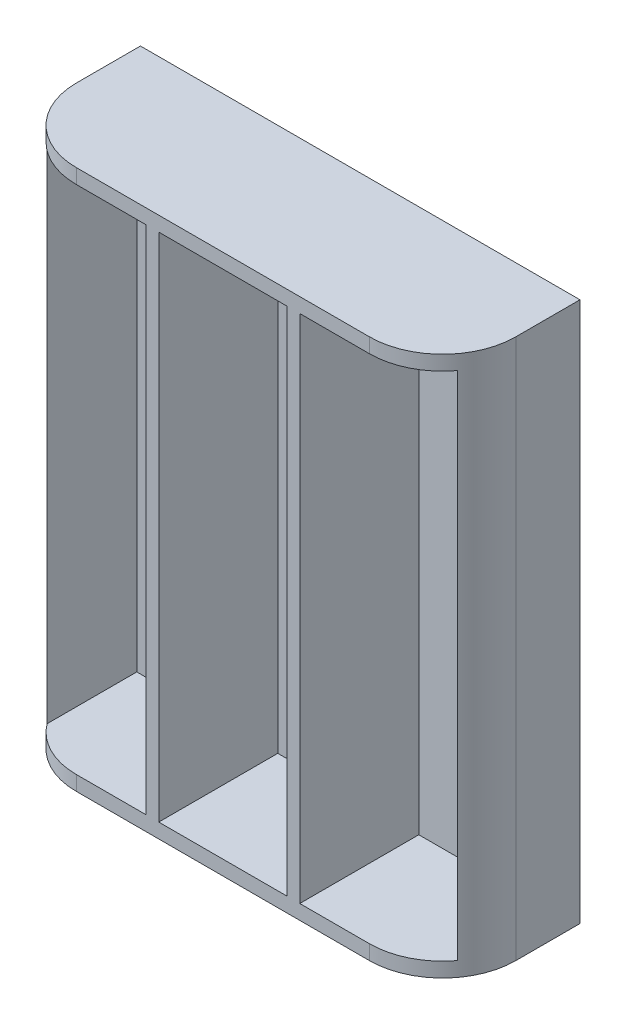
ISO-10303-21;
HEADER;
FILE_DESCRIPTION(('STEP AP214'),'2;1');
FILE_NAME('part.step','',(''),(''),'','','');
FILE_SCHEMA(('AUTOMOTIVE_DESIGN { 1 0 10303 214 1 1 1 1 }'));
ENDSEC;
DATA;
#1=APPLICATION_CONTEXT('core data for automotive mechanical design processes');
#2=APPLICATION_PROTOCOL_DEFINITION('international standard','automotive_design',2000,#1);
#3=PRODUCT_CONTEXT('',#1,'mechanical');
#4=PRODUCT('Part','Part','',(#3));
#5=PRODUCT_RELATED_PRODUCT_CATEGORY('part','',(#4));
#6=PRODUCT_DEFINITION_FORMATION('','',#4);
#7=PRODUCT_DEFINITION_CONTEXT('part definition',#1,'design');
#8=PRODUCT_DEFINITION('design','',#6,#7);
#9=PRODUCT_DEFINITION_SHAPE('','',#8);
#10=(LENGTH_UNIT() NAMED_UNIT(*) SI_UNIT(.MILLI.,.METRE.));
#11=(NAMED_UNIT(*) PLANE_ANGLE_UNIT() SI_UNIT($,.RADIAN.));
#12=(NAMED_UNIT(*) SI_UNIT($,.STERADIAN.) SOLID_ANGLE_UNIT());
#13=UNCERTAINTY_MEASURE_WITH_UNIT(LENGTH_MEASURE(1.E-05),#10,'distance_accuracy_value','');
#14=(GEOMETRIC_REPRESENTATION_CONTEXT(3) GLOBAL_UNCERTAINTY_ASSIGNED_CONTEXT((#13)) GLOBAL_UNIT_ASSIGNED_CONTEXT((#10,
#11,#12)) REPRESENTATION_CONTEXT('',''));
#15=CARTESIAN_POINT('',(0.,0.,0.));
#16=DIRECTION('',(0.,0.,1.));
#17=DIRECTION('',(1.,0.,0.));
#18=AXIS2_PLACEMENT_3D('',#15,#16,#17);
#19=CARTESIAN_POINT('',(24.,-29.5,2.));
#20=DIRECTION('',(-1.,0.,0.));
#21=DIRECTION('',(0.,0.,1.));
#22=AXIS2_PLACEMENT_3D('',#19,#20,#21);
#23=PLANE('',#22);
#24=DIRECTION('',(0.,1.,0.));
#25=VECTOR('',#24,1.);
#26=CARTESIAN_POINT('',(24.,-29.5,0.));
#27=LINE('',#26,#25);
#28=CARTESIAN_POINT('',(24.,-29.5,0.));
#29=VERTEX_POINT('',#28);
#30=CARTESIAN_POINT('',(24.,29.5,0.));
#31=VERTEX_POINT('',#30);
#32=EDGE_CURVE('E303',#29,#31,#27,.T.);
#33=ORIENTED_EDGE('',*,*,#32,.T.);
#34=DIRECTION('',(0.,0.,-1.));
#35=VECTOR('',#34,1.);
#36=CARTESIAN_POINT('',(24.,29.5,2.));
#37=LINE('',#36,#35);
#38=CARTESIAN_POINT('',(24.,29.5,7.));
#39=VERTEX_POINT('',#38);
#40=EDGE_CURVE('E321',#39,#31,#37,.T.);
#41=ORIENTED_EDGE('',*,*,#40,.F.);
#42=DIRECTION('',(0.,-1.,0.));
#43=VECTOR('',#42,1.);
#44=CARTESIAN_POINT('',(24.,79.2292670366254,7.));
#45=LINE('',#44,#43);
#46=CARTESIAN_POINT('',(24.,-29.5,7.));
#47=VERTEX_POINT('',#46);
#48=EDGE_CURVE('E277',#39,#47,#45,.T.);
#49=ORIENTED_EDGE('',*,*,#48,.T.);
#50=DIRECTION('',(0.,0.,-1.));
#51=VECTOR('',#50,1.);
#52=CARTESIAN_POINT('',(24.,-29.5,2.));
#53=LINE('',#52,#51);
#54=EDGE_CURVE('E312',#47,#29,#53,.T.);
#55=ORIENTED_EDGE('',*,*,#54,.T.);
#56=EDGE_LOOP('',(#33,#41,#49,#55));
#57=FACE_BOUND('',#56,.T.);
#58=ADVANCED_FACE('F35',(#57),#23,.F.);
#59=CARTESIAN_POINT('',(-24.,29.5,2.));
#60=DIRECTION('',(0.,-1.,0.));
#61=DIRECTION('',(0.,0.,-1.));
#62=AXIS2_PLACEMENT_3D('',#59,#60,#61);
#63=PLANE('',#62);
#64=DIRECTION('',(-1.,0.,0.));
#65=VECTOR('',#64,1.);
#66=CARTESIAN_POINT('',(-24.,29.5,0.));
#67=LINE('',#66,#65);
#68=CARTESIAN_POINT('',(-24.,29.5,0.));
#69=VERTEX_POINT('',#68);
#70=EDGE_CURVE('E306',#31,#69,#67,.T.);
#71=ORIENTED_EDGE('',*,*,#70,.T.);
#72=DIRECTION('',(0.,0.,-1.));
#73=VECTOR('',#72,1.);
#74=CARTESIAN_POINT('',(-24.,29.5,2.));
#75=LINE('',#74,#73);
#76=CARTESIAN_POINT('',(-24.,29.5,7.));
#77=VERTEX_POINT('',#76);
#78=EDGE_CURVE('E318',#77,#69,#75,.T.);
#79=ORIENTED_EDGE('',*,*,#78,.F.);
#80=CARTESIAN_POINT('',(-16.,29.5,7.));
#81=DIRECTION('',(0.,-1.,0.));
#82=DIRECTION('',(0.,0.,-1.));
#83=AXIS2_PLACEMENT_3D('',#80,#81,#82);
#84=CIRCLE('',#83,8.);
#85=CARTESIAN_POINT('',(-16.,29.5,15.));
#86=VERTEX_POINT('',#85);
#87=EDGE_CURVE('E274',#77,#86,#84,.F.);
#88=ORIENTED_EDGE('',*,*,#87,.T.);
#89=DIRECTION('',(1.,0.,0.));
#90=VECTOR('',#89,1.);
#91=CARTESIAN_POINT('',(-16.,29.5,15.));
#92=LINE('',#91,#90);
#93=CARTESIAN_POINT('',(16.,29.5,15.));
#94=VERTEX_POINT('',#93);
#95=EDGE_CURVE('E280',#86,#94,#92,.T.);
#96=ORIENTED_EDGE('',*,*,#95,.T.);
#97=CARTESIAN_POINT('',(16.,29.5,7.));
#98=DIRECTION('',(0.,-1.,0.));
#99=DIRECTION('',(0.,0.,-1.));
#100=AXIS2_PLACEMENT_3D('',#97,#98,#99);
#101=CIRCLE('',#100,8.);
#102=EDGE_CURVE('E276',#94,#39,#101,.F.);
#103=ORIENTED_EDGE('',*,*,#102,.T.);
#104=ORIENTED_EDGE('',*,*,#40,.T.);
#105=EDGE_LOOP('',(#71,#79,#88,#96,#103,#104));
#106=FACE_BOUND('',#105,.T.);
#107=ADVANCED_FACE('F370',(#106),#63,.F.);
#108=CARTESIAN_POINT('',(-24.,-29.5,2.));
#109=DIRECTION('',(1.,0.,0.));
#110=DIRECTION('',(0.,0.,-1.));
#111=AXIS2_PLACEMENT_3D('',#108,#109,#110);
#112=PLANE('',#111);
#113=DIRECTION('',(0.,-1.,0.));
#114=VECTOR('',#113,1.);
#115=CARTESIAN_POINT('',(-24.,-29.5,0.));
#116=LINE('',#115,#114);
#117=CARTESIAN_POINT('',(-24.,-29.5,0.));
#118=VERTEX_POINT('',#117);
#119=EDGE_CURVE('E308',#69,#118,#116,.T.);
#120=ORIENTED_EDGE('',*,*,#119,.T.);
#121=DIRECTION('',(0.,0.,-1.));
#122=VECTOR('',#121,1.);
#123=CARTESIAN_POINT('',(-24.,-29.5,2.));
#124=LINE('',#123,#122);
#125=CARTESIAN_POINT('',(-24.,-29.5,7.));
#126=VERTEX_POINT('',#125);
#127=EDGE_CURVE('E315',#126,#118,#124,.T.);
#128=ORIENTED_EDGE('',*,*,#127,.F.);
#129=DIRECTION('',(0.,-1.,0.));
#130=VECTOR('',#129,1.);
#131=CARTESIAN_POINT('',(-24.,79.2292670366254,7.));
#132=LINE('',#131,#130);
#133=EDGE_CURVE('E292',#77,#126,#132,.T.);
#134=ORIENTED_EDGE('',*,*,#133,.F.);
#135=ORIENTED_EDGE('',*,*,#78,.T.);
#136=EDGE_LOOP('',(#120,#128,#134,#135));
#137=FACE_BOUND('',#136,.T.);
#138=ADVANCED_FACE('F373',(#137),#112,.F.);
#139=CARTESIAN_POINT('',(-24.,-29.5,2.));
#140=DIRECTION('',(0.,1.,0.));
#141=DIRECTION('',(0.,0.,1.));
#142=AXIS2_PLACEMENT_3D('',#139,#140,#141);
#143=PLANE('',#142);
#144=DIRECTION('',(1.,0.,0.));
#145=VECTOR('',#144,1.);
#146=CARTESIAN_POINT('',(-24.,-29.5,0.));
#147=LINE('',#146,#145);
#148=EDGE_CURVE('E310',#118,#29,#147,.T.);
#149=ORIENTED_EDGE('',*,*,#148,.T.);
#150=ORIENTED_EDGE('',*,*,#54,.F.);
#151=CARTESIAN_POINT('',(16.,-29.5,7.));
#152=DIRECTION('',(0.,-1.,0.));
#153=DIRECTION('',(0.,0.,-1.));
#154=AXIS2_PLACEMENT_3D('',#151,#152,#153);
#155=CIRCLE('',#154,8.);
#156=CARTESIAN_POINT('',(16.,-29.5,15.));
#157=VERTEX_POINT('',#156);
#158=EDGE_CURVE('E273',#47,#157,#155,.T.);
#159=ORIENTED_EDGE('',*,*,#158,.T.);
#160=DIRECTION('',(-1.,0.,0.));
#161=VECTOR('',#160,1.);
#162=CARTESIAN_POINT('',(-16.,-29.5,15.));
#163=LINE('',#162,#161);
#164=CARTESIAN_POINT('',(-16.,-29.5,15.));
#165=VERTEX_POINT('',#164);
#166=EDGE_CURVE('E283',#157,#165,#163,.T.);
#167=ORIENTED_EDGE('',*,*,#166,.T.);
#168=CARTESIAN_POINT('',(-16.,-29.5,7.));
#169=DIRECTION('',(0.,-1.,0.));
#170=DIRECTION('',(0.,0.,1.));
#171=AXIS2_PLACEMENT_3D('',#168,#169,#170);
#172=CIRCLE('',#171,8.);
#173=EDGE_CURVE('E286',#165,#126,#172,.T.);
#174=ORIENTED_EDGE('',*,*,#173,.T.);
#175=ORIENTED_EDGE('',*,*,#127,.T.);
#176=EDGE_LOOP('',(#149,#150,#159,#167,#174,#175));
#177=FACE_BOUND('',#176,.T.);
#178=ADVANCED_FACE('F348',(#177),#143,.F.);
#179=CARTESIAN_POINT('',(0.,0.,0.));
#180=DIRECTION('',(0.,0.,-1.));
#181=DIRECTION('',(-1.,0.,0.));
#182=AXIS2_PLACEMENT_3D('',#179,#180,#181);
#183=PLANE('',#182);
#184=ORIENTED_EDGE('',*,*,#32,.F.);
#185=ORIENTED_EDGE('',*,*,#148,.F.);
#186=ORIENTED_EDGE('',*,*,#119,.F.);
#187=ORIENTED_EDGE('',*,*,#70,.F.);
#188=EDGE_LOOP('',(#184,#185,#186,#187));
#189=FACE_BOUND('',#188,.T.);
#190=ADVANCED_FACE('F378',(#189),#183,.T.);
#191=CARTESIAN_POINT('',(16.,79.2292670366254,7.));
#192=DIRECTION('',(0.,-1.,0.));
#193=DIRECTION('',(0.,0.,-1.));
#194=AXIS2_PLACEMENT_3D('',#191,#192,#193);
#195=CYLINDRICAL_SURFACE('',#194,8.);
#196=CARTESIAN_POINT('',(16.,-27.9,7.));
#197=DIRECTION('',(0.,-1.,0.));
#198=DIRECTION('',(1.,0.,0.));
#199=AXIS2_PLACEMENT_3D('',#196,#197,#198);
#200=CIRCLE('',#199,8.);
#201=CARTESIAN_POINT('',(16.,-27.9,15.));
#202=VERTEX_POINT('',#201);
#203=CARTESIAN_POINT('',(22.4,-27.9,11.8));
#204=VERTEX_POINT('',#203);
#205=EDGE_CURVE('E239',#202,#204,#200,.F.);
#206=ORIENTED_EDGE('',*,*,#205,.F.);
#207=DIRECTION('',(0.,-1.,0.));
#208=VECTOR('',#207,1.);
#209=CARTESIAN_POINT('',(16.,79.2292670366254,15.));
#210=LINE('',#209,#208);
#211=EDGE_CURVE('E289',#202,#157,#210,.T.);
#212=ORIENTED_EDGE('',*,*,#211,.T.);
#213=ORIENTED_EDGE('',*,*,#158,.F.);
#214=ORIENTED_EDGE('',*,*,#48,.F.);
#215=ORIENTED_EDGE('',*,*,#102,.F.);
#216=CARTESIAN_POINT('',(16.,27.9,15.));
#217=VERTEX_POINT('',#216);
#218=EDGE_CURVE('E299',#94,#217,#210,.T.);
#219=ORIENTED_EDGE('',*,*,#218,.T.);
#220=CARTESIAN_POINT('',(16.,27.9,7.));
#221=DIRECTION('',(0.,1.,0.));
#222=DIRECTION('',(-1.,0.,0.));
#223=AXIS2_PLACEMENT_3D('',#220,#221,#222);
#224=CIRCLE('',#223,8.);
#225=CARTESIAN_POINT('',(22.4,27.9,11.8));
#226=VERTEX_POINT('',#225);
#227=EDGE_CURVE('E57',#226,#217,#224,.F.);
#228=ORIENTED_EDGE('',*,*,#227,.F.);
#229=DIRECTION('',(0.,-1.,0.));
#230=VECTOR('',#229,1.);
#231=CARTESIAN_POINT('',(22.4,79.2292670366254,11.8));
#232=LINE('',#231,#230);
#233=EDGE_CURVE('E326',#204,#226,#232,.F.);
#234=ORIENTED_EDGE('',*,*,#233,.F.);
#235=EDGE_LOOP('',(#206,#212,#213,#214,#215,#219,#228,#234));
#236=FACE_BOUND('',#235,.T.);
#237=ADVANCED_FACE('F352',(#236),#195,.T.);
#238=CARTESIAN_POINT('',(-16.,79.2292670366254,7.));
#239=DIRECTION('',(0.,-1.,0.));
#240=DIRECTION('',(0.,0.,-1.));
#241=AXIS2_PLACEMENT_3D('',#238,#239,#240);
#242=CYLINDRICAL_SURFACE('',#241,8.);
#243=CARTESIAN_POINT('',(-16.,-27.9,7.));
#244=DIRECTION('',(0.,-1.,0.));
#245=DIRECTION('',(0.,0.,-1.));
#246=AXIS2_PLACEMENT_3D('',#243,#244,#245);
#247=CIRCLE('',#246,8.);
#248=CARTESIAN_POINT('',(-22.4,-27.9,11.8));
#249=VERTEX_POINT('',#248);
#250=CARTESIAN_POINT('',(-16.,-27.9,15.));
#251=VERTEX_POINT('',#250);
#252=EDGE_CURVE('E209',#249,#251,#247,.F.);
#253=ORIENTED_EDGE('',*,*,#252,.F.);
#254=DIRECTION('',(0.,-1.,0.));
#255=VECTOR('',#254,1.);
#256=CARTESIAN_POINT('',(-22.4,79.2292670366254,11.8));
#257=LINE('',#256,#255);
#258=CARTESIAN_POINT('',(-22.4,27.9,11.8));
#259=VERTEX_POINT('',#258);
#260=EDGE_CURVE('E12',#259,#249,#257,.T.);
#261=ORIENTED_EDGE('',*,*,#260,.F.);
#262=CARTESIAN_POINT('',(-16.,27.9,7.));
#263=DIRECTION('',(0.,1.,0.));
#264=DIRECTION('',(0.,0.,1.));
#265=AXIS2_PLACEMENT_3D('',#262,#263,#264);
#266=CIRCLE('',#265,8.);
#267=CARTESIAN_POINT('',(-16.,27.9,15.));
#268=VERTEX_POINT('',#267);
#269=EDGE_CURVE('E207',#268,#259,#266,.F.);
#270=ORIENTED_EDGE('',*,*,#269,.F.);
#271=DIRECTION('',(0.,-1.,0.));
#272=VECTOR('',#271,1.);
#273=CARTESIAN_POINT('',(-16.,79.2292670366254,15.));
#274=LINE('',#273,#272);
#275=EDGE_CURVE('E295',#86,#268,#274,.T.);
#276=ORIENTED_EDGE('',*,*,#275,.F.);
#277=ORIENTED_EDGE('',*,*,#87,.F.);
#278=ORIENTED_EDGE('',*,*,#133,.T.);
#279=ORIENTED_EDGE('',*,*,#173,.F.);
#280=EDGE_CURVE('E298',#251,#165,#274,.T.);
#281=ORIENTED_EDGE('',*,*,#280,.F.);
#282=EDGE_LOOP('',(#253,#261,#270,#276,#277,#278,#279,#281));
#283=FACE_BOUND('',#282,.T.);
#284=ADVANCED_FACE('F340',(#283),#242,.T.);
#285=CARTESIAN_POINT('',(-16.,79.2292670366254,15.));
#286=DIRECTION('',(0.,0.,1.));
#287=DIRECTION('',(1.,0.,0.));
#288=AXIS2_PLACEMENT_3D('',#285,#286,#287);
#289=PLANE('',#288);
#290=DIRECTION('',(1.,0.,0.));
#291=VECTOR('',#290,1.);
#292=CARTESIAN_POINT('',(-16.,-27.9,15.));
#293=LINE('',#292,#291);
#294=CARTESIAN_POINT('',(-8.40000000000001,-27.9,15.));
#295=VERTEX_POINT('',#294);
#296=EDGE_CURVE('E42',#251,#295,#293,.T.);
#297=ORIENTED_EDGE('',*,*,#296,.F.);
#298=ORIENTED_EDGE('',*,*,#280,.T.);
#299=ORIENTED_EDGE('',*,*,#166,.F.);
#300=ORIENTED_EDGE('',*,*,#211,.F.);
#301=DIRECTION('',(1.,0.,0.));
#302=VECTOR('',#301,1.);
#303=CARTESIAN_POINT('',(22.4,-27.9,15.));
#304=LINE('',#303,#302);
#305=CARTESIAN_POINT('',(8.40000000000001,-27.9,15.));
#306=VERTEX_POINT('',#305);
#307=EDGE_CURVE('E212',#306,#202,#304,.T.);
#308=ORIENTED_EDGE('',*,*,#307,.F.);
#309=DIRECTION('',(0.,-1.,0.));
#310=VECTOR('',#309,1.);
#311=CARTESIAN_POINT('',(8.4,27.9,15.));
#312=LINE('',#311,#310);
#313=CARTESIAN_POINT('',(8.4,27.9,15.));
#314=VERTEX_POINT('',#313);
#315=EDGE_CURVE('E211',#314,#306,#312,.T.);
#316=ORIENTED_EDGE('',*,*,#315,.F.);
#317=DIRECTION('',(-1.,0.,0.));
#318=VECTOR('',#317,1.);
#319=CARTESIAN_POINT('',(-16.,27.9,15.));
#320=LINE('',#319,#318);
#321=EDGE_CURVE('E324',#217,#314,#320,.T.);
#322=ORIENTED_EDGE('',*,*,#321,.F.);
#323=ORIENTED_EDGE('',*,*,#218,.F.);
#324=ORIENTED_EDGE('',*,*,#95,.F.);
#325=ORIENTED_EDGE('',*,*,#275,.T.);
#326=DIRECTION('',(-1.,0.,0.));
#327=VECTOR('',#326,1.);
#328=CARTESIAN_POINT('',(-22.4,27.9,15.));
#329=LINE('',#328,#327);
#330=CARTESIAN_POINT('',(-8.40000000000001,27.9,15.));
#331=VERTEX_POINT('',#330);
#332=EDGE_CURVE('E195',#331,#268,#329,.T.);
#333=ORIENTED_EDGE('',*,*,#332,.F.);
#334=DIRECTION('',(0.,1.,0.));
#335=VECTOR('',#334,1.);
#336=CARTESIAN_POINT('',(-8.40000000000001,27.9,15.));
#337=LINE('',#336,#335);
#338=EDGE_CURVE('E49',#295,#331,#337,.T.);
#339=ORIENTED_EDGE('',*,*,#338,.F.);
#340=EDGE_LOOP('',(#297,#298,#299,#300,#308,#316,#322,#323,#324,#325,#333,#339));
#341=FACE_BOUND('',#340,.T.);
#342=DIRECTION('',(-1.,0.,0.));
#343=VECTOR('',#342,1.);
#344=CARTESIAN_POINT('',(-7.,27.9,15.));
#345=LINE('',#344,#343);
#346=CARTESIAN_POINT('',(7.,27.9,15.));
#347=VERTEX_POINT('',#346);
#348=CARTESIAN_POINT('',(-7.,27.9,15.));
#349=VERTEX_POINT('',#348);
#350=EDGE_CURVE('E248',#347,#349,#345,.T.);
#351=ORIENTED_EDGE('',*,*,#350,.F.);
#352=DIRECTION('',(0.,1.,0.));
#353=VECTOR('',#352,1.);
#354=CARTESIAN_POINT('',(7.,27.9,15.));
#355=LINE('',#354,#353);
#356=CARTESIAN_POINT('',(7.,-27.9,15.));
#357=VERTEX_POINT('',#356);
#358=EDGE_CURVE('E241',#357,#347,#355,.T.);
#359=ORIENTED_EDGE('',*,*,#358,.F.);
#360=DIRECTION('',(1.,0.,0.));
#361=VECTOR('',#360,1.);
#362=CARTESIAN_POINT('',(-7.,-27.9,15.));
#363=LINE('',#362,#361);
#364=CARTESIAN_POINT('',(-7.,-27.9,15.));
#365=VERTEX_POINT('',#364);
#366=EDGE_CURVE('E242',#365,#357,#363,.T.);
#367=ORIENTED_EDGE('',*,*,#366,.F.);
#368=DIRECTION('',(0.,-1.,0.));
#369=VECTOR('',#368,1.);
#370=CARTESIAN_POINT('',(-7.,27.9,15.));
#371=LINE('',#370,#369);
#372=EDGE_CURVE('E245',#349,#365,#371,.T.);
#373=ORIENTED_EDGE('',*,*,#372,.F.);
#374=EDGE_LOOP('',(#351,#359,#367,#373));
#375=FACE_BOUND('',#374,.T.);
#376=ADVANCED_FACE('F332',(#341,#375),#289,.T.);
#377=CARTESIAN_POINT('',(0.,0.,2.));
#378=DIRECTION('',(0.,0.,-1.));
#379=DIRECTION('',(-1.,0.,0.));
#380=AXIS2_PLACEMENT_3D('',#377,#378,#379);
#381=PLANE('',#380);
#382=DIRECTION('',(0.,1.,0.));
#383=VECTOR('',#382,1.);
#384=CARTESIAN_POINT('',(7.,27.9,2.));
#385=LINE('',#384,#383);
#386=CARTESIAN_POINT('',(7.,-27.9,2.));
#387=VERTEX_POINT('',#386);
#388=CARTESIAN_POINT('',(7.,27.9,2.));
#389=VERTEX_POINT('',#388);
#390=EDGE_CURVE('E256',#387,#389,#385,.T.);
#391=ORIENTED_EDGE('',*,*,#390,.T.);
#392=DIRECTION('',(-1.,0.,0.));
#393=VECTOR('',#392,1.);
#394=CARTESIAN_POINT('',(-7.,27.9,2.));
#395=LINE('',#394,#393);
#396=CARTESIAN_POINT('',(-7.,27.9,2.));
#397=VERTEX_POINT('',#396);
#398=EDGE_CURVE('E244',#389,#397,#395,.T.);
#399=ORIENTED_EDGE('',*,*,#398,.T.);
#400=DIRECTION('',(0.,-1.,0.));
#401=VECTOR('',#400,1.);
#402=CARTESIAN_POINT('',(-7.,27.9,2.));
#403=LINE('',#402,#401);
#404=CARTESIAN_POINT('',(-7.,-27.9,2.));
#405=VERTEX_POINT('',#404);
#406=EDGE_CURVE('E265',#397,#405,#403,.T.);
#407=ORIENTED_EDGE('',*,*,#406,.T.);
#408=DIRECTION('',(1.,0.,0.));
#409=VECTOR('',#408,1.);
#410=CARTESIAN_POINT('',(-7.,-27.9,2.));
#411=LINE('',#410,#409);
#412=EDGE_CURVE('E261',#405,#387,#411,.T.);
#413=ORIENTED_EDGE('',*,*,#412,.T.);
#414=EDGE_LOOP('',(#391,#399,#407,#413));
#415=FACE_BOUND('',#414,.T.);
#416=ADVANCED_FACE('F397',(#415),#381,.F.);
#417=CARTESIAN_POINT('',(-7.,27.9,-57.5294707084986));
#418=DIRECTION('',(0.,1.,0.));
#419=DIRECTION('',(0.,0.,1.));
#420=AXIS2_PLACEMENT_3D('',#417,#418,#419);
#421=PLANE('',#420);
#422=DIRECTION('',(0.,0.,1.));
#423=VECTOR('',#422,1.);
#424=CARTESIAN_POINT('',(7.,27.9,-57.5294707084986));
#425=LINE('',#424,#423);
#426=EDGE_CURVE('E259',#389,#347,#425,.T.);
#427=ORIENTED_EDGE('',*,*,#426,.T.);
#428=ORIENTED_EDGE('',*,*,#350,.T.);
#429=DIRECTION('',(0.,0.,1.));
#430=VECTOR('',#429,1.);
#431=CARTESIAN_POINT('',(-7.,27.9,-57.5294707084986));
#432=LINE('',#431,#430);
#433=EDGE_CURVE('E255',#397,#349,#432,.T.);
#434=ORIENTED_EDGE('',*,*,#433,.F.);
#435=ORIENTED_EDGE('',*,*,#398,.F.);
#436=EDGE_LOOP('',(#427,#428,#434,#435));
#437=FACE_BOUND('',#436,.T.);
#438=ADVANCED_FACE('F402',(#437),#421,.F.);
#439=CARTESIAN_POINT('',(-7.,27.9,-57.5294707084986));
#440=DIRECTION('',(-1.,0.,0.));
#441=DIRECTION('',(0.,0.,1.));
#442=AXIS2_PLACEMENT_3D('',#439,#440,#441);
#443=PLANE('',#442);
#444=ORIENTED_EDGE('',*,*,#433,.T.);
#445=ORIENTED_EDGE('',*,*,#372,.T.);
#446=DIRECTION('',(0.,0.,1.));
#447=VECTOR('',#446,1.);
#448=CARTESIAN_POINT('',(-7.,-27.9,-57.5294707084986));
#449=LINE('',#448,#447);
#450=EDGE_CURVE('E264',#405,#365,#449,.T.);
#451=ORIENTED_EDGE('',*,*,#450,.F.);
#452=ORIENTED_EDGE('',*,*,#406,.F.);
#453=EDGE_LOOP('',(#444,#445,#451,#452));
#454=FACE_BOUND('',#453,.T.);
#455=ADVANCED_FACE('F406',(#454),#443,.F.);
#456=CARTESIAN_POINT('',(-7.,-27.9,-57.5294707084986));
#457=DIRECTION('',(0.,-1.,0.));
#458=DIRECTION('',(0.,0.,-1.));
#459=AXIS2_PLACEMENT_3D('',#456,#457,#458);
#460=PLANE('',#459);
#461=ORIENTED_EDGE('',*,*,#450,.T.);
#462=ORIENTED_EDGE('',*,*,#366,.T.);
#463=DIRECTION('',(0.,0.,1.));
#464=VECTOR('',#463,1.);
#465=CARTESIAN_POINT('',(7.,-27.9,-57.5294707084986));
#466=LINE('',#465,#464);
#467=EDGE_CURVE('E260',#387,#357,#466,.T.);
#468=ORIENTED_EDGE('',*,*,#467,.F.);
#469=ORIENTED_EDGE('',*,*,#412,.F.);
#470=EDGE_LOOP('',(#461,#462,#468,#469));
#471=FACE_BOUND('',#470,.T.);
#472=ADVANCED_FACE('F410',(#471),#460,.F.);
#473=CARTESIAN_POINT('',(7.,27.9,-57.5294707084986));
#474=DIRECTION('',(1.,0.,0.));
#475=DIRECTION('',(0.,0.,-1.));
#476=AXIS2_PLACEMENT_3D('',#473,#474,#475);
#477=PLANE('',#476);
#478=ORIENTED_EDGE('',*,*,#467,.T.);
#479=ORIENTED_EDGE('',*,*,#358,.T.);
#480=ORIENTED_EDGE('',*,*,#426,.F.);
#481=ORIENTED_EDGE('',*,*,#390,.F.);
#482=EDGE_LOOP('',(#478,#479,#480,#481));
#483=FACE_BOUND('',#482,.T.);
#484=ADVANCED_FACE('F414',(#483),#477,.F.);
#485=CARTESIAN_POINT('',(0.,0.,2.));
#486=DIRECTION('',(0.,0.,-1.));
#487=DIRECTION('',(-1.,0.,0.));
#488=AXIS2_PLACEMENT_3D('',#485,#486,#487);
#489=PLANE('',#488);
#490=DIRECTION('',(-1.,0.,0.));
#491=VECTOR('',#490,1.);
#492=CARTESIAN_POINT('',(22.4,27.9,2.));
#493=LINE('',#492,#491);
#494=CARTESIAN_POINT('',(22.4,27.9,2.));
#495=VERTEX_POINT('',#494);
#496=CARTESIAN_POINT('',(8.4,27.9,2.));
#497=VERTEX_POINT('',#496);
#498=EDGE_CURVE('E220',#495,#497,#493,.T.);
#499=ORIENTED_EDGE('',*,*,#498,.T.);
#500=DIRECTION('',(0.,-1.,0.));
#501=VECTOR('',#500,1.);
#502=CARTESIAN_POINT('',(8.4,27.9,2.));
#503=LINE('',#502,#501);
#504=CARTESIAN_POINT('',(8.40000000000001,-27.9,2.));
#505=VERTEX_POINT('',#504);
#506=EDGE_CURVE('E214',#497,#505,#503,.T.);
#507=ORIENTED_EDGE('',*,*,#506,.T.);
#508=DIRECTION('',(1.,0.,0.));
#509=VECTOR('',#508,1.);
#510=CARTESIAN_POINT('',(22.4,-27.9,2.));
#511=LINE('',#510,#509);
#512=CARTESIAN_POINT('',(22.4,-27.9,2.));
#513=VERTEX_POINT('',#512);
#514=EDGE_CURVE('E229',#505,#513,#511,.T.);
#515=ORIENTED_EDGE('',*,*,#514,.T.);
#516=DIRECTION('',(0.,1.,0.));
#517=VECTOR('',#516,1.);
#518=CARTESIAN_POINT('',(22.4,27.9,2.));
#519=LINE('',#518,#517);
#520=EDGE_CURVE('E225',#513,#495,#519,.T.);
#521=ORIENTED_EDGE('',*,*,#520,.T.);
#522=EDGE_LOOP('',(#499,#507,#515,#521));
#523=FACE_BOUND('',#522,.T.);
#524=ADVANCED_FACE('F362',(#523),#489,.F.);
#525=CARTESIAN_POINT('',(8.4,27.9,-57.5294707084986));
#526=DIRECTION('',(-1.,0.,0.));
#527=DIRECTION('',(0.,-1.,0.));
#528=AXIS2_PLACEMENT_3D('',#525,#526,#527);
#529=PLANE('',#528);
#530=DIRECTION('',(0.,0.,1.));
#531=VECTOR('',#530,1.);
#532=CARTESIAN_POINT('',(8.4,27.9,-57.5294707084986));
#533=LINE('',#532,#531);
#534=EDGE_CURVE('E223',#497,#314,#533,.T.);
#535=ORIENTED_EDGE('',*,*,#534,.T.);
#536=ORIENTED_EDGE('',*,*,#315,.T.);
#537=DIRECTION('',(0.,0.,1.));
#538=VECTOR('',#537,1.);
#539=CARTESIAN_POINT('',(8.40000000000001,-27.9,-57.5294707084986));
#540=LINE('',#539,#538);
#541=EDGE_CURVE('E219',#505,#306,#540,.T.);
#542=ORIENTED_EDGE('',*,*,#541,.F.);
#543=ORIENTED_EDGE('',*,*,#506,.F.);
#544=EDGE_LOOP('',(#535,#536,#542,#543));
#545=FACE_BOUND('',#544,.T.);
#546=ADVANCED_FACE('F366',(#545),#529,.F.);
#547=CARTESIAN_POINT('',(22.4,-27.9,-57.5294707084986));
#548=DIRECTION('',(0.,-1.,0.));
#549=DIRECTION('',(1.,0.,0.));
#550=AXIS2_PLACEMENT_3D('',#547,#548,#549);
#551=PLANE('',#550);
#552=ORIENTED_EDGE('',*,*,#205,.T.);
#553=DIRECTION('',(0.,0.,1.));
#554=VECTOR('',#553,1.);
#555=CARTESIAN_POINT('',(22.4,-27.9,-57.5294707084986));
#556=LINE('',#555,#554);
#557=EDGE_CURVE('E228',#513,#204,#556,.T.);
#558=ORIENTED_EDGE('',*,*,#557,.F.);
#559=ORIENTED_EDGE('',*,*,#514,.F.);
#560=ORIENTED_EDGE('',*,*,#541,.T.);
#561=ORIENTED_EDGE('',*,*,#307,.T.);
#562=EDGE_LOOP('',(#552,#558,#559,#560,#561));
#563=FACE_BOUND('',#562,.T.);
#564=ADVANCED_FACE('F357',(#563),#551,.F.);
#565=CARTESIAN_POINT('',(22.4,27.9,-57.5294707084986));
#566=DIRECTION('',(1.,0.,0.));
#567=DIRECTION('',(0.,1.,0.));
#568=AXIS2_PLACEMENT_3D('',#565,#566,#567);
#569=PLANE('',#568);
#570=ORIENTED_EDGE('',*,*,#233,.T.);
#571=DIRECTION('',(0.,0.,1.));
#572=VECTOR('',#571,1.);
#573=CARTESIAN_POINT('',(22.4,27.9,-57.5294707084986));
#574=LINE('',#573,#572);
#575=EDGE_CURVE('E224',#495,#226,#574,.T.);
#576=ORIENTED_EDGE('',*,*,#575,.F.);
#577=ORIENTED_EDGE('',*,*,#520,.F.);
#578=ORIENTED_EDGE('',*,*,#557,.T.);
#579=EDGE_LOOP('',(#570,#576,#577,#578));
#580=FACE_BOUND('',#579,.T.);
#581=ADVANCED_FACE('F359',(#580),#569,.F.);
#582=CARTESIAN_POINT('',(22.4,27.9,-57.5294707084986));
#583=DIRECTION('',(0.,1.,0.));
#584=DIRECTION('',(-1.,0.,0.));
#585=AXIS2_PLACEMENT_3D('',#582,#583,#584);
#586=PLANE('',#585);
#587=ORIENTED_EDGE('',*,*,#227,.T.);
#588=ORIENTED_EDGE('',*,*,#321,.T.);
#589=ORIENTED_EDGE('',*,*,#534,.F.);
#590=ORIENTED_EDGE('',*,*,#498,.F.);
#591=ORIENTED_EDGE('',*,*,#575,.T.);
#592=EDGE_LOOP('',(#587,#588,#589,#590,#591));
#593=FACE_BOUND('',#592,.T.);
#594=ADVANCED_FACE('F427',(#593),#586,.F.);
#595=CARTESIAN_POINT('',(0.,0.,2.));
#596=DIRECTION('',(0.,0.,-1.));
#597=DIRECTION('',(-1.,0.,0.));
#598=AXIS2_PLACEMENT_3D('',#595,#596,#597);
#599=PLANE('',#598);
#600=DIRECTION('',(-1.,0.,0.));
#601=VECTOR('',#600,1.);
#602=CARTESIAN_POINT('',(-22.4,27.9,2.));
#603=LINE('',#602,#601);
#604=CARTESIAN_POINT('',(-8.40000000000001,27.9,2.));
#605=VERTEX_POINT('',#604);
#606=CARTESIAN_POINT('',(-22.4,27.9,2.));
#607=VERTEX_POINT('',#606);
#608=EDGE_CURVE('E192',#605,#607,#603,.T.);
#609=ORIENTED_EDGE('',*,*,#608,.T.);
#610=DIRECTION('',(0.,-1.,0.));
#611=VECTOR('',#610,1.);
#612=CARTESIAN_POINT('',(-22.4,27.9,2.));
#613=LINE('',#612,#611);
#614=CARTESIAN_POINT('',(-22.4,-27.9,2.));
#615=VERTEX_POINT('',#614);
#616=EDGE_CURVE('E187',#607,#615,#613,.T.);
#617=ORIENTED_EDGE('',*,*,#616,.T.);
#618=DIRECTION('',(1.,0.,0.));
#619=VECTOR('',#618,1.);
#620=CARTESIAN_POINT('',(-22.4,-27.9,2.));
#621=LINE('',#620,#619);
#622=CARTESIAN_POINT('',(-8.40000000000001,-27.9,2.));
#623=VERTEX_POINT('',#622);
#624=EDGE_CURVE('E174',#615,#623,#621,.T.);
#625=ORIENTED_EDGE('',*,*,#624,.T.);
#626=DIRECTION('',(0.,1.,0.));
#627=VECTOR('',#626,1.);
#628=CARTESIAN_POINT('',(-8.40000000000001,27.9,2.));
#629=LINE('',#628,#627);
#630=EDGE_CURVE('E202',#623,#605,#629,.T.);
#631=ORIENTED_EDGE('',*,*,#630,.T.);
#632=EDGE_LOOP('',(#609,#617,#625,#631));
#633=FACE_BOUND('',#632,.T.);
#634=ADVANCED_FACE('F191',(#633),#599,.F.);
#635=CARTESIAN_POINT('',(-22.4,27.9,-57.5294707084986));
#636=DIRECTION('',(-1.,0.,0.));
#637=DIRECTION('',(0.,0.,1.));
#638=AXIS2_PLACEMENT_3D('',#635,#636,#637);
#639=PLANE('',#638);
#640=ORIENTED_EDGE('',*,*,#260,.T.);
#641=DIRECTION('',(0.,0.,1.));
#642=VECTOR('',#641,1.);
#643=CARTESIAN_POINT('',(-22.4,-27.9,-57.5294707084986));
#644=LINE('',#643,#642);
#645=EDGE_CURVE('E177',#615,#249,#644,.T.);
#646=ORIENTED_EDGE('',*,*,#645,.F.);
#647=ORIENTED_EDGE('',*,*,#616,.F.);
#648=DIRECTION('',(0.,0.,1.));
#649=VECTOR('',#648,1.);
#650=CARTESIAN_POINT('',(-22.4,27.9,-57.5294707084986));
#651=LINE('',#650,#649);
#652=EDGE_CURVE('E200',#607,#259,#651,.T.);
#653=ORIENTED_EDGE('',*,*,#652,.T.);
#654=EDGE_LOOP('',(#640,#646,#647,#653));
#655=FACE_BOUND('',#654,.T.);
#656=ADVANCED_FACE('F185',(#655),#639,.F.);
#657=CARTESIAN_POINT('',(-22.4,-27.9,-57.5294707084986));
#658=DIRECTION('',(0.,-1.,0.));
#659=DIRECTION('',(0.,0.,-1.));
#660=AXIS2_PLACEMENT_3D('',#657,#658,#659);
#661=PLANE('',#660);
#662=ORIENTED_EDGE('',*,*,#252,.T.);
#663=ORIENTED_EDGE('',*,*,#296,.T.);
#664=DIRECTION('',(0.,0.,1.));
#665=VECTOR('',#664,1.);
#666=CARTESIAN_POINT('',(-8.40000000000001,-27.9,-57.5294707084986));
#667=LINE('',#666,#665);
#668=EDGE_CURVE('E179',#623,#295,#667,.T.);
#669=ORIENTED_EDGE('',*,*,#668,.F.);
#670=ORIENTED_EDGE('',*,*,#624,.F.);
#671=ORIENTED_EDGE('',*,*,#645,.T.);
#672=EDGE_LOOP('',(#662,#663,#669,#670,#671));
#673=FACE_BOUND('',#672,.T.);
#674=ADVANCED_FACE('F176',(#673),#661,.F.);
#675=CARTESIAN_POINT('',(-8.40000000000001,27.9,-57.5294707084986));
#676=DIRECTION('',(1.,0.,0.));
#677=DIRECTION('',(0.,0.,-1.));
#678=AXIS2_PLACEMENT_3D('',#675,#676,#677);
#679=PLANE('',#678);
#680=ORIENTED_EDGE('',*,*,#668,.T.);
#681=ORIENTED_EDGE('',*,*,#338,.T.);
#682=DIRECTION('',(0.,0.,1.));
#683=VECTOR('',#682,1.);
#684=CARTESIAN_POINT('',(-8.40000000000001,27.9,-57.5294707084986));
#685=LINE('',#684,#683);
#686=EDGE_CURVE('E201',#605,#331,#685,.T.);
#687=ORIENTED_EDGE('',*,*,#686,.F.);
#688=ORIENTED_EDGE('',*,*,#630,.F.);
#689=EDGE_LOOP('',(#680,#681,#687,#688));
#690=FACE_BOUND('',#689,.T.);
#691=ADVANCED_FACE('F330',(#690),#679,.F.);
#692=CARTESIAN_POINT('',(-22.4,27.9,-57.5294707084986));
#693=DIRECTION('',(0.,1.,0.));
#694=DIRECTION('',(0.,0.,1.));
#695=AXIS2_PLACEMENT_3D('',#692,#693,#694);
#696=PLANE('',#695);
#697=ORIENTED_EDGE('',*,*,#269,.T.);
#698=ORIENTED_EDGE('',*,*,#652,.F.);
#699=ORIENTED_EDGE('',*,*,#608,.F.);
#700=ORIENTED_EDGE('',*,*,#686,.T.);
#701=ORIENTED_EDGE('',*,*,#332,.T.);
#702=EDGE_LOOP('',(#697,#698,#699,#700,#701));
#703=FACE_BOUND('',#702,.T.);
#704=ADVANCED_FACE('F338',(#703),#696,.F.);
#705=CLOSED_SHELL('',(#58,#107,#138,#178,#190,#237,#284,#376,#416,#438,#455,#472,#484,#524,#546,
#564,#581,#594,#634,#656,#674,#691,#704));
#706=MANIFOLD_SOLID_BREP('B2',#705);
#707=ADVANCED_BREP_SHAPE_REPRESENTATION('',(#18,#706),#14);
#708=SHAPE_DEFINITION_REPRESENTATION(#9,#707);
ENDSEC;
END-ISO-10303-21;
